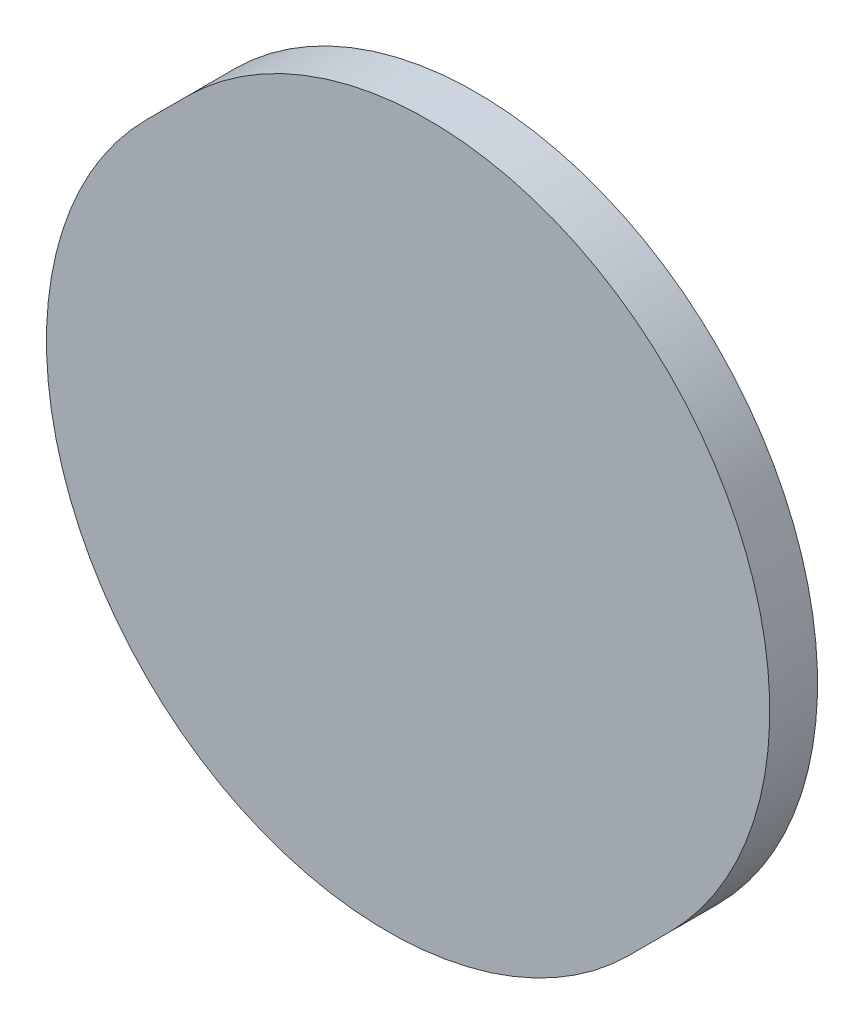
ISO-10303-21;
HEADER;
FILE_DESCRIPTION(('STEP AP214'),'2;1');
FILE_NAME('part.step','',(''),(''),'','','');
FILE_SCHEMA(('AUTOMOTIVE_DESIGN { 1 0 10303 214 1 1 1 1 }'));
ENDSEC;
DATA;
#1=APPLICATION_CONTEXT('core data for automotive mechanical design processes');
#2=APPLICATION_PROTOCOL_DEFINITION('international standard','automotive_design',2000,#1);
#3=PRODUCT_CONTEXT('',#1,'mechanical');
#4=PRODUCT('Part','Part','',(#3));
#5=PRODUCT_RELATED_PRODUCT_CATEGORY('part','',(#4));
#6=PRODUCT_DEFINITION_FORMATION('','',#4);
#7=PRODUCT_DEFINITION_CONTEXT('part definition',#1,'design');
#8=PRODUCT_DEFINITION('design','',#6,#7);
#9=PRODUCT_DEFINITION_SHAPE('','',#8);
#10=(LENGTH_UNIT() NAMED_UNIT(*) SI_UNIT(.MILLI.,.METRE.));
#11=(NAMED_UNIT(*) PLANE_ANGLE_UNIT() SI_UNIT($,.RADIAN.));
#12=(NAMED_UNIT(*) SI_UNIT($,.STERADIAN.) SOLID_ANGLE_UNIT());
#13=UNCERTAINTY_MEASURE_WITH_UNIT(LENGTH_MEASURE(1.E-05),#10,'distance_accuracy_value','');
#14=(GEOMETRIC_REPRESENTATION_CONTEXT(3) GLOBAL_UNCERTAINTY_ASSIGNED_CONTEXT((#13)) GLOBAL_UNIT_ASSIGNED_CONTEXT((#10,
#11,#12)) REPRESENTATION_CONTEXT('',''));
#15=CARTESIAN_POINT('',(0.,0.,0.));
#16=DIRECTION('',(0.,0.,1.));
#17=DIRECTION('',(1.,0.,0.));
#18=AXIS2_PLACEMENT_3D('',#15,#16,#17);
#19=CARTESIAN_POINT('',(104.118722,-58.623223,1.635));
#20=DIRECTION('',(0.,0.,1.));
#21=DIRECTION('',(1.,0.,0.));
#22=AXIS2_PLACEMENT_3D('',#19,#20,#21);
#23=PLANE('',#22);
#24=DIRECTION('',(-0.707106781187048,-0.707106781186048,0.));
#25=VECTOR('',#24,1.);
#26=CARTESIAN_POINT('',(104.118722,-58.623223,1.635));
#27=LINE('',#26,#25);
#28=CARTESIAN_POINT('',(104.118722,-58.623223,1.635));
#29=VERTEX_POINT('',#28);
#30=CARTESIAN_POINT('',(104.088722,-58.653223,1.635));
#31=VERTEX_POINT('',#30);
#32=EDGE_CURVE('E82',#29,#31,#27,.T.);
#33=ORIENTED_EDGE('',*,*,#32,.T.);
#34=CARTESIAN_POINT('',(104.2654985,-58.8299995,1.635));
#35=DIRECTION('',(0.,0.,1.));
#36=DIRECTION('',(-0.707106781186548,0.707106781186548,0.));
#37=AXIS2_PLACEMENT_3D('',#34,#35,#36);
#38=CIRCLE('',#37,0.249999723809);
#39=CARTESIAN_POINT('',(104.442275,-59.006776,1.635));
#40=VERTEX_POINT('',#39);
#41=EDGE_CURVE('E106',#31,#40,#38,.T.);
#42=ORIENTED_EDGE('',*,*,#41,.T.);
#43=DIRECTION('',(0.707106781186548,0.707106781186548,0.));
#44=VECTOR('',#43,1.);
#45=CARTESIAN_POINT('',(104.442275,-59.006776,1.635));
#46=LINE('',#45,#44);
#47=CARTESIAN_POINT('',(104.472275,-58.976776,1.635));
#48=VERTEX_POINT('',#47);
#49=EDGE_CURVE('E75',#40,#48,#46,.T.);
#50=ORIENTED_EDGE('',*,*,#49,.T.);
#51=CARTESIAN_POINT('',(104.2954985,-58.7999995,1.635));
#52=DIRECTION('',(0.,0.,1.));
#53=DIRECTION('',(0.707106781186548,-0.707106781186548,0.));
#54=AXIS2_PLACEMENT_3D('',#51,#52,#53);
#55=CIRCLE('',#54,0.249999723809);
#56=EDGE_CURVE('E11',#48,#29,#55,.T.);
#57=ORIENTED_EDGE('',*,*,#56,.T.);
#58=EDGE_LOOP('',(#33,#42,#50,#57));
#59=FACE_BOUND('',#58,.T.);
#60=ADVANCED_FACE('F17',(#59),#23,.T.);
#61=CARTESIAN_POINT('',(104.118722,-58.623223,1.6));
#62=DIRECTION('',(0.,0.,1.));
#63=DIRECTION('',(1.,0.,0.));
#64=AXIS2_PLACEMENT_3D('',#61,#62,#63);
#65=PLANE('',#64);
#66=CARTESIAN_POINT('',(104.2954985,-58.7999995,1.6));
#67=DIRECTION('',(0.,0.,1.));
#68=DIRECTION('',(0.707106781186548,-0.707106781186548,0.));
#69=AXIS2_PLACEMENT_3D('',#66,#67,#68);
#70=CIRCLE('',#69,0.249999723809);
#71=CARTESIAN_POINT('',(104.472275,-58.976776,1.6));
#72=VERTEX_POINT('',#71);
#73=CARTESIAN_POINT('',(104.118722,-58.623223,1.6));
#74=VERTEX_POINT('',#73);
#75=EDGE_CURVE('E26',#72,#74,#70,.T.);
#76=ORIENTED_EDGE('',*,*,#75,.F.);
#77=DIRECTION('',(0.707106781186548,0.707106781186548,0.));
#78=VECTOR('',#77,1.);
#79=CARTESIAN_POINT('',(104.442275,-59.006776,1.6));
#80=LINE('',#79,#78);
#81=CARTESIAN_POINT('',(104.442275,-59.006776,1.6));
#82=VERTEX_POINT('',#81);
#83=EDGE_CURVE('E110',#82,#72,#80,.T.);
#84=ORIENTED_EDGE('',*,*,#83,.F.);
#85=CARTESIAN_POINT('',(104.2654985,-58.8299995,1.6));
#86=DIRECTION('',(0.,0.,1.));
#87=DIRECTION('',(-0.707106781186548,0.707106781186548,0.));
#88=AXIS2_PLACEMENT_3D('',#85,#86,#87);
#89=CIRCLE('',#88,0.249999723809);
#90=CARTESIAN_POINT('',(104.088722,-58.653223,1.6));
#91=VERTEX_POINT('',#90);
#92=EDGE_CURVE('E84',#91,#82,#89,.T.);
#93=ORIENTED_EDGE('',*,*,#92,.F.);
#94=DIRECTION('',(-0.707106781187048,-0.707106781186048,0.));
#95=VECTOR('',#94,1.);
#96=CARTESIAN_POINT('',(104.118722,-58.623223,1.6));
#97=LINE('',#96,#95);
#98=EDGE_CURVE('E80',#74,#91,#97,.T.);
#99=ORIENTED_EDGE('',*,*,#98,.F.);
#100=EDGE_LOOP('',(#76,#84,#93,#99));
#101=FACE_BOUND('',#100,.T.);
#102=ADVANCED_FACE('F19',(#101),#65,.F.);
#103=CARTESIAN_POINT('',(104.2954985,-58.7999995,1.6));
#104=DIRECTION('',(0.,0.,-1.));
#105=DIRECTION('',(0.707106781186548,-0.707106781186548,0.));
#106=AXIS2_PLACEMENT_3D('',#103,#104,#105);
#107=CYLINDRICAL_SURFACE('',#106,0.249999723809);
#108=ORIENTED_EDGE('',*,*,#75,.T.);
#109=DIRECTION('',(0.,0.,1.));
#110=VECTOR('',#109,1.);
#111=CARTESIAN_POINT('',(104.118722,-58.623223,1.6));
#112=LINE('',#111,#110);
#113=EDGE_CURVE('E69',#74,#29,#112,.T.);
#114=ORIENTED_EDGE('',*,*,#113,.T.);
#115=ORIENTED_EDGE('',*,*,#56,.F.);
#116=DIRECTION('',(0.,0.,1.));
#117=VECTOR('',#116,1.);
#118=CARTESIAN_POINT('',(104.472275,-58.976776,1.6));
#119=LINE('',#118,#117);
#120=EDGE_CURVE('E72',#72,#48,#119,.T.);
#121=ORIENTED_EDGE('',*,*,#120,.F.);
#122=EDGE_LOOP('',(#108,#114,#115,#121));
#123=FACE_BOUND('',#122,.T.);
#124=ADVANCED_FACE('F68',(#123),#107,.T.);
#125=CARTESIAN_POINT('',(104.442275,-59.006776,1.6));
#126=DIRECTION('',(-0.707106781186548,0.707106781186548,0.));
#127=DIRECTION('',(0.,0.,1.));
#128=AXIS2_PLACEMENT_3D('',#125,#126,#127);
#129=PLANE('',#128);
#130=ORIENTED_EDGE('',*,*,#83,.T.);
#131=ORIENTED_EDGE('',*,*,#120,.T.);
#132=ORIENTED_EDGE('',*,*,#49,.F.);
#133=DIRECTION('',(0.,0.,1.));
#134=VECTOR('',#133,1.);
#135=CARTESIAN_POINT('',(104.442275,-59.006776,1.6));
#136=LINE('',#135,#134);
#137=EDGE_CURVE('E102',#82,#40,#136,.T.);
#138=ORIENTED_EDGE('',*,*,#137,.F.);
#139=EDGE_LOOP('',(#130,#131,#132,#138));
#140=FACE_BOUND('',#139,.T.);
#141=ADVANCED_FACE('F121',(#140),#129,.F.);
#142=CARTESIAN_POINT('',(104.2654985,-58.8299995,1.6));
#143=DIRECTION('',(0.,0.,-1.));
#144=DIRECTION('',(-0.707106781186548,0.707106781186548,0.));
#145=AXIS2_PLACEMENT_3D('',#142,#143,#144);
#146=CYLINDRICAL_SURFACE('',#145,0.249999723809);
#147=ORIENTED_EDGE('',*,*,#92,.T.);
#148=ORIENTED_EDGE('',*,*,#137,.T.);
#149=ORIENTED_EDGE('',*,*,#41,.F.);
#150=DIRECTION('',(0.,0.,1.));
#151=VECTOR('',#150,1.);
#152=CARTESIAN_POINT('',(104.088722,-58.653223,1.6));
#153=LINE('',#152,#151);
#154=EDGE_CURVE('E89',#91,#31,#153,.T.);
#155=ORIENTED_EDGE('',*,*,#154,.F.);
#156=EDGE_LOOP('',(#147,#148,#149,#155));
#157=FACE_BOUND('',#156,.T.);
#158=ADVANCED_FACE('F124',(#157),#146,.T.);
#159=CARTESIAN_POINT('',(104.118722,-58.623223,1.6));
#160=DIRECTION('',(0.707106781186048,-0.707106781187048,0.));
#161=DIRECTION('',(0.,0.,-1.));
#162=AXIS2_PLACEMENT_3D('',#159,#160,#161);
#163=PLANE('',#162);
#164=ORIENTED_EDGE('',*,*,#98,.T.);
#165=ORIENTED_EDGE('',*,*,#154,.T.);
#166=ORIENTED_EDGE('',*,*,#32,.F.);
#167=ORIENTED_EDGE('',*,*,#113,.F.);
#168=EDGE_LOOP('',(#164,#165,#166,#167));
#169=FACE_BOUND('',#168,.T.);
#170=ADVANCED_FACE('F78',(#169),#163,.F.);
#171=CLOSED_SHELL('',(#60,#102,#124,#141,#158,#170));
#172=MANIFOLD_SOLID_BREP('B1',#171);
#173=ADVANCED_BREP_SHAPE_REPRESENTATION('',(#18,#172),#14);
#174=SHAPE_DEFINITION_REPRESENTATION(#9,#173);
ENDSEC;
END-ISO-10303-21;
